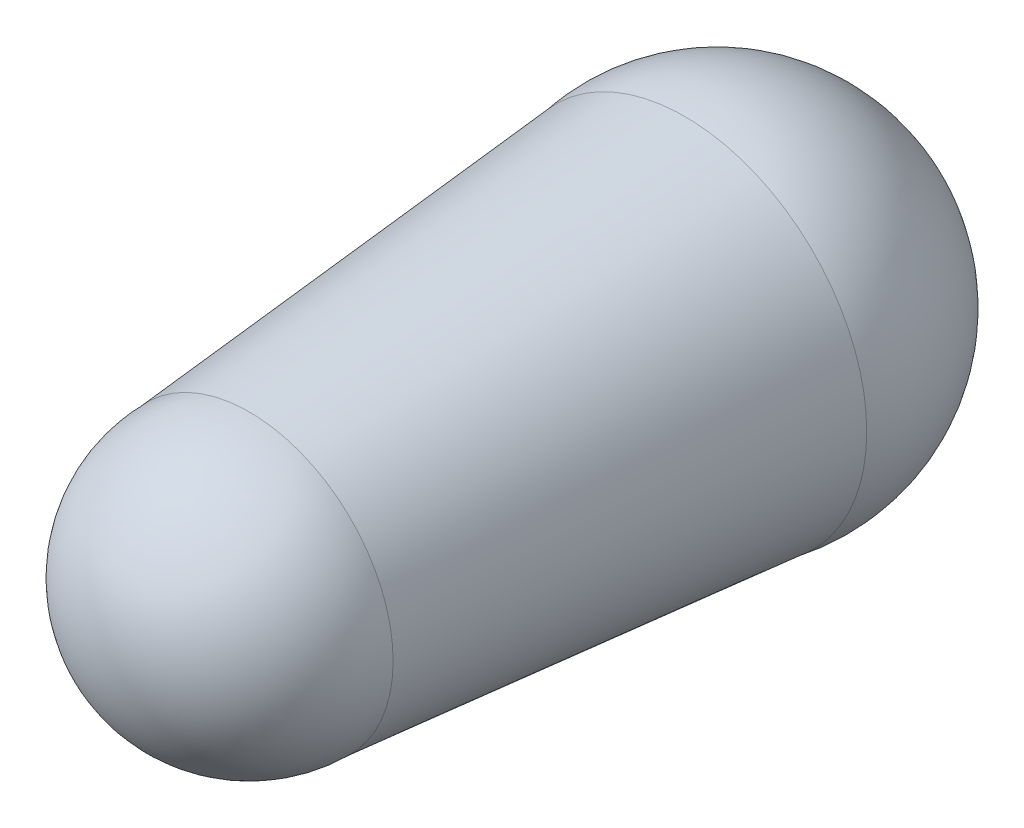
ISO-10303-21;
HEADER;
FILE_DESCRIPTION(('STEP AP214'),'2;1');
FILE_NAME('part.step','',(''),(''),'','','');
FILE_SCHEMA(('AUTOMOTIVE_DESIGN { 1 0 10303 214 1 1 1 1 }'));
ENDSEC;
DATA;
#1=APPLICATION_CONTEXT('core data for automotive mechanical design processes');
#2=APPLICATION_PROTOCOL_DEFINITION('international standard','automotive_design',2000,#1);
#3=PRODUCT_CONTEXT('',#1,'mechanical');
#4=PRODUCT('Part','Part','',(#3));
#5=PRODUCT_RELATED_PRODUCT_CATEGORY('part','',(#4));
#6=PRODUCT_DEFINITION_FORMATION('','',#4);
#7=PRODUCT_DEFINITION_CONTEXT('part definition',#1,'design');
#8=PRODUCT_DEFINITION('design','',#6,#7);
#9=PRODUCT_DEFINITION_SHAPE('','',#8);
#10=(LENGTH_UNIT() NAMED_UNIT(*) SI_UNIT(.MILLI.,.METRE.));
#11=(NAMED_UNIT(*) PLANE_ANGLE_UNIT() SI_UNIT($,.RADIAN.));
#12=(NAMED_UNIT(*) SI_UNIT($,.STERADIAN.) SOLID_ANGLE_UNIT());
#13=UNCERTAINTY_MEASURE_WITH_UNIT(LENGTH_MEASURE(1.E-05),#10,'distance_accuracy_value','');
#14=(GEOMETRIC_REPRESENTATION_CONTEXT(3) GLOBAL_UNCERTAINTY_ASSIGNED_CONTEXT((#13)) GLOBAL_UNIT_ASSIGNED_CONTEXT((#10,
#11,#12)) REPRESENTATION_CONTEXT('',''));
#15=CARTESIAN_POINT('',(0.,0.,0.));
#16=DIRECTION('',(0.,0.,1.));
#17=DIRECTION('',(1.,0.,0.));
#18=AXIS2_PLACEMENT_3D('',#15,#16,#17);
#19=CARTESIAN_POINT('',(0.,0.,0.));
#20=DIRECTION('',(0.,1.,0.));
#21=DIRECTION('',(1.,0.,0.));
#22=AXIS2_PLACEMENT_3D('',#19,#20,#21);
#23=SPHERICAL_SURFACE('',#22,3.95);
#24=CARTESIAN_POINT('',(0.,0.,0.));
#25=DIRECTION('',(0.,0.,-1.));
#26=DIRECTION('',(-1.,0.,0.));
#27=AXIS2_PLACEMENT_3D('',#24,#25,#26);
#28=SPHERICAL_SURFACE('',#27,3.95);
#29=CARTESIAN_POINT('',(0.,0.,0.685910301784271));
#30=DIRECTION('',(0.,0.,-1.));
#31=DIRECTION('',(-1.,0.,0.));
#32=AXIS2_PLACEMENT_3D('',#29,#30,#31);
#33=CIRCLE('',#32,3.88999062439823);
#34=CARTESIAN_POINT('',(-3.88999062439823,0.,0.685910301784271));
#35=VERTEX_POINT('',#34);
#36=EDGE_CURVE('E10',#35,#35,#33,.F.);
#37=ORIENTED_EDGE('',*,*,#36,.F.);
#38=EDGE_LOOP('',(#37));
#39=FACE_BOUND('',#38,.T.);
#40=ADVANCED_FACE('F31',(#39),#28,.T.);
#41=CARTESIAN_POINT('',(0.,0.,0.));
#42=DIRECTION('',(0.,0.,-1.));
#43=DIRECTION('',(1.,0.,0.));
#44=AXIS2_PLACEMENT_3D('',#41,#42,#43);
#45=CONICAL_SURFACE('',#44,3.95,0.0872664625997165);
#46=CARTESIAN_POINT('',(0.,0.,10.));
#47=DIRECTION('',(0.,0.,1.));
#48=DIRECTION('',(1.,0.,0.));
#49=AXIS2_PLACEMENT_3D('',#46,#47,#48);
#50=CIRCLE('',#49,3.07511336474076);
#51=CARTESIAN_POINT('',(3.07511336474076,0.,10.));
#52=VERTEX_POINT('',#51);
#53=EDGE_CURVE('E37',#52,#52,#50,.T.);
#54=ORIENTED_EDGE('',*,*,#53,.F.);
#55=EDGE_LOOP('',(#54));
#56=FACE_BOUND('',#55,.T.);
#57=ORIENTED_EDGE('',*,*,#36,.T.);
#58=EDGE_LOOP('',(#57));
#59=FACE_BOUND('',#58,.T.);
#60=ADVANCED_FACE('F45',(#56,#59),#45,.T.);
#61=CARTESIAN_POINT('',(0.,0.,10.));
#62=DIRECTION('',(0.,1.,0.));
#63=DIRECTION('',(1.,0.,0.));
#64=AXIS2_PLACEMENT_3D('',#61,#62,#63);
#65=SPHERICAL_SURFACE('',#64,3.07511336474076);
#66=CARTESIAN_POINT('',(0.,0.,10.));
#67=DIRECTION('',(0.,0.,1.));
#68=DIRECTION('',(1.,0.,0.));
#69=AXIS2_PLACEMENT_3D('',#66,#67,#68);
#70=SPHERICAL_SURFACE('',#69,3.07511336474076);
#71=ORIENTED_EDGE('',*,*,#53,.T.);
#72=EDGE_LOOP('',(#71));
#73=FACE_BOUND('',#72,.T.);
#74=ADVANCED_FACE('F43',(#73),#70,.T.);
#75=CLOSED_SHELL('',(#40,#60,#74));
#76=MANIFOLD_SOLID_BREP('B2',#75);
#77=ADVANCED_BREP_SHAPE_REPRESENTATION('',(#18,#76),#14);
#78=SHAPE_DEFINITION_REPRESENTATION(#9,#77);
ENDSEC;
END-ISO-10303-21;
